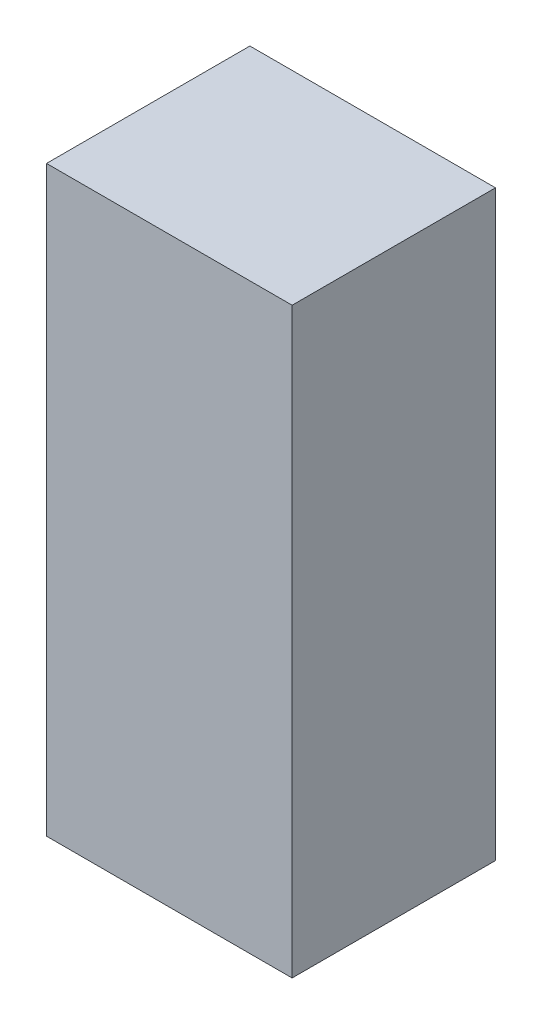
ISO-10303-21;
HEADER;
FILE_DESCRIPTION(('STEP AP214'),'2;1');
FILE_NAME('part.step','',(''),(''),'','','');
FILE_SCHEMA(('AUTOMOTIVE_DESIGN { 1 0 10303 214 1 1 1 1 }'));
ENDSEC;
DATA;
#1=APPLICATION_CONTEXT('core data for automotive mechanical design processes');
#2=APPLICATION_PROTOCOL_DEFINITION('international standard','automotive_design',2000,#1);
#3=PRODUCT_CONTEXT('',#1,'mechanical');
#4=PRODUCT('Part','Part','',(#3));
#5=PRODUCT_RELATED_PRODUCT_CATEGORY('part','',(#4));
#6=PRODUCT_DEFINITION_FORMATION('','',#4);
#7=PRODUCT_DEFINITION_CONTEXT('part definition',#1,'design');
#8=PRODUCT_DEFINITION('design','',#6,#7);
#9=PRODUCT_DEFINITION_SHAPE('','',#8);
#10=(LENGTH_UNIT() NAMED_UNIT(*) SI_UNIT(.MILLI.,.METRE.));
#11=(NAMED_UNIT(*) PLANE_ANGLE_UNIT() SI_UNIT($,.RADIAN.));
#12=(NAMED_UNIT(*) SI_UNIT($,.STERADIAN.) SOLID_ANGLE_UNIT());
#13=UNCERTAINTY_MEASURE_WITH_UNIT(LENGTH_MEASURE(1.E-05),#10,'distance_accuracy_value','');
#14=(GEOMETRIC_REPRESENTATION_CONTEXT(3) GLOBAL_UNCERTAINTY_ASSIGNED_CONTEXT((#13)) GLOBAL_UNIT_ASSIGNED_CONTEXT((#10,
#11,#12)) REPRESENTATION_CONTEXT('',''));
#15=CARTESIAN_POINT('',(0.,0.,0.));
#16=DIRECTION('',(0.,0.,1.));
#17=DIRECTION('',(1.,0.,0.));
#18=AXIS2_PLACEMENT_3D('',#15,#16,#17);
#19=CARTESIAN_POINT('',(0.,0.,0.));
#20=DIRECTION('',(0.,0.,1.));
#21=DIRECTION('',(1.,0.,0.));
#22=AXIS2_PLACEMENT_3D('',#19,#20,#21);
#23=PLANE('',#22);
#24=DIRECTION('',(0.,1.,0.));
#25=VECTOR('',#24,1.);
#26=CARTESIAN_POINT('',(2.4153692647815,-2.9,0.));
#27=LINE('',#26,#25);
#28=CARTESIAN_POINT('',(2.4153692647815,2.83,0.));
#29=VERTEX_POINT('',#28);
#30=CARTESIAN_POINT('',(2.4153692647815,-2.9,0.));
#31=VERTEX_POINT('',#30);
#32=EDGE_CURVE('E58',#29,#31,#27,.F.);
#33=ORIENTED_EDGE('',*,*,#32,.F.);
#34=DIRECTION('',(-1.,0.,0.));
#35=VECTOR('',#34,1.);
#36=CARTESIAN_POINT('',(2.4153692647815,2.83,0.));
#37=LINE('',#36,#35);
#38=CARTESIAN_POINT('',(0.,2.83,0.));
#39=VERTEX_POINT('',#38);
#40=EDGE_CURVE('E53',#39,#29,#37,.F.);
#41=ORIENTED_EDGE('',*,*,#40,.F.);
#42=DIRECTION('',(0.,1.,0.));
#43=VECTOR('',#42,1.);
#44=CARTESIAN_POINT('',(0.,2.83,0.));
#45=LINE('',#44,#43);
#46=CARTESIAN_POINT('',(0.,-2.9,0.));
#47=VERTEX_POINT('',#46);
#48=EDGE_CURVE('E68',#47,#39,#45,.T.);
#49=ORIENTED_EDGE('',*,*,#48,.F.);
#50=DIRECTION('',(1.,0.,0.));
#51=VECTOR('',#50,1.);
#52=CARTESIAN_POINT('',(0.,-2.9,0.));
#53=LINE('',#52,#51);
#54=EDGE_CURVE('E20',#31,#47,#53,.F.);
#55=ORIENTED_EDGE('',*,*,#54,.F.);
#56=EDGE_LOOP('',(#33,#41,#49,#55));
#57=FACE_BOUND('',#56,.T.);
#58=ADVANCED_FACE('F17',(#57),#23,.T.);
#59=CARTESIAN_POINT('',(0.,-2.9,-2.));
#60=DIRECTION('',(0.,-1.,0.));
#61=DIRECTION('',(0.,0.,-1.));
#62=AXIS2_PLACEMENT_3D('',#59,#60,#61);
#63=PLANE('',#62);
#64=DIRECTION('',(1.,0.,0.));
#65=VECTOR('',#64,1.);
#66=CARTESIAN_POINT('',(0.,-2.9,-2.));
#67=LINE('',#66,#65);
#68=CARTESIAN_POINT('',(0.,-2.9,-2.));
#69=VERTEX_POINT('',#68);
#70=CARTESIAN_POINT('',(2.4153692647815,-2.9,-2.));
#71=VERTEX_POINT('',#70);
#72=EDGE_CURVE('E74',#69,#71,#67,.T.);
#73=ORIENTED_EDGE('',*,*,#72,.T.);
#74=DIRECTION('',(0.,0.,1.));
#75=VECTOR('',#74,1.);
#76=CARTESIAN_POINT('',(2.4153692647815,-2.9,-2.));
#77=LINE('',#76,#75);
#78=EDGE_CURVE('E63',#31,#71,#77,.F.);
#79=ORIENTED_EDGE('',*,*,#78,.F.);
#80=ORIENTED_EDGE('',*,*,#54,.T.);
#81=DIRECTION('',(0.,0.,1.));
#82=VECTOR('',#81,1.);
#83=CARTESIAN_POINT('',(0.,-2.9,-2.));
#84=LINE('',#83,#82);
#85=EDGE_CURVE('E81',#69,#47,#84,.T.);
#86=ORIENTED_EDGE('',*,*,#85,.F.);
#87=EDGE_LOOP('',(#73,#79,#80,#86));
#88=FACE_BOUND('',#87,.T.);
#89=ADVANCED_FACE('F73',(#88),#63,.T.);
#90=CARTESIAN_POINT('',(2.4153692647815,-2.9,-2.));
#91=DIRECTION('',(1.,0.,0.));
#92=DIRECTION('',(0.,1.,0.));
#93=AXIS2_PLACEMENT_3D('',#90,#91,#92);
#94=PLANE('',#93);
#95=DIRECTION('',(0.,1.,0.));
#96=VECTOR('',#95,1.);
#97=CARTESIAN_POINT('',(2.4153692647815,0.,-2.));
#98=LINE('',#97,#96);
#99=CARTESIAN_POINT('',(2.4153692647815,2.83,-2.));
#100=VERTEX_POINT('',#99);
#101=EDGE_CURVE('E84',#71,#100,#98,.T.);
#102=ORIENTED_EDGE('',*,*,#101,.T.);
#103=DIRECTION('',(0.,0.,1.));
#104=VECTOR('',#103,1.);
#105=CARTESIAN_POINT('',(2.4153692647815,2.83,-2.));
#106=LINE('',#105,#104);
#107=EDGE_CURVE('E65',#29,#100,#106,.F.);
#108=ORIENTED_EDGE('',*,*,#107,.F.);
#109=ORIENTED_EDGE('',*,*,#32,.T.);
#110=ORIENTED_EDGE('',*,*,#78,.T.);
#111=EDGE_LOOP('',(#102,#108,#109,#110));
#112=FACE_BOUND('',#111,.T.);
#113=ADVANCED_FACE('F61',(#112),#94,.T.);
#114=CARTESIAN_POINT('',(2.4153692647815,2.83,-2.));
#115=DIRECTION('',(0.,1.,0.));
#116=DIRECTION('',(-1.,0.,0.));
#117=AXIS2_PLACEMENT_3D('',#114,#115,#116);
#118=PLANE('',#117);
#119=DIRECTION('',(1.,0.,0.));
#120=VECTOR('',#119,1.);
#121=CARTESIAN_POINT('',(0.,2.83,-2.));
#122=LINE('',#121,#120);
#123=CARTESIAN_POINT('',(0.,2.83,-2.));
#124=VERTEX_POINT('',#123);
#125=EDGE_CURVE('E26',#100,#124,#122,.F.);
#126=ORIENTED_EDGE('',*,*,#125,.T.);
#127=DIRECTION('',(0.,0.,1.));
#128=VECTOR('',#127,1.);
#129=CARTESIAN_POINT('',(0.,2.83,-2.));
#130=LINE('',#129,#128);
#131=EDGE_CURVE('E34',#39,#124,#130,.F.);
#132=ORIENTED_EDGE('',*,*,#131,.F.);
#133=ORIENTED_EDGE('',*,*,#40,.T.);
#134=ORIENTED_EDGE('',*,*,#107,.T.);
#135=EDGE_LOOP('',(#126,#132,#133,#134));
#136=FACE_BOUND('',#135,.T.);
#137=ADVANCED_FACE('F88',(#136),#118,.T.);
#138=CARTESIAN_POINT('',(0.,2.83,-2.));
#139=DIRECTION('',(-1.,0.,0.));
#140=DIRECTION('',(0.,0.,1.));
#141=AXIS2_PLACEMENT_3D('',#138,#139,#140);
#142=PLANE('',#141);
#143=DIRECTION('',(0.,1.,0.));
#144=VECTOR('',#143,1.);
#145=CARTESIAN_POINT('',(0.,0.,-2.));
#146=LINE('',#145,#144);
#147=EDGE_CURVE('E11',#124,#69,#146,.F.);
#148=ORIENTED_EDGE('',*,*,#147,.T.);
#149=ORIENTED_EDGE('',*,*,#85,.T.);
#150=ORIENTED_EDGE('',*,*,#48,.T.);
#151=ORIENTED_EDGE('',*,*,#131,.T.);
#152=EDGE_LOOP('',(#148,#149,#150,#151));
#153=FACE_BOUND('',#152,.T.);
#154=ADVANCED_FACE('F91',(#153),#142,.T.);
#155=CARTESIAN_POINT('',(0.,0.,-2.));
#156=DIRECTION('',(0.,0.,1.));
#157=DIRECTION('',(1.,0.,0.));
#158=AXIS2_PLACEMENT_3D('',#155,#156,#157);
#159=PLANE('',#158);
#160=ORIENTED_EDGE('',*,*,#125,.F.);
#161=ORIENTED_EDGE('',*,*,#101,.F.);
#162=ORIENTED_EDGE('',*,*,#72,.F.);
#163=ORIENTED_EDGE('',*,*,#147,.F.);
#164=EDGE_LOOP('',(#160,#161,#162,#163));
#165=FACE_BOUND('',#164,.T.);
#166=ADVANCED_FACE('F90',(#165),#159,.F.);
#167=CLOSED_SHELL('',(#58,#89,#113,#137,#154,#166));
#168=MANIFOLD_SOLID_BREP('B1',#167);
#169=ADVANCED_BREP_SHAPE_REPRESENTATION('',(#18,#168),#14);
#170=SHAPE_DEFINITION_REPRESENTATION(#9,#169);
ENDSEC;
END-ISO-10303-21;
